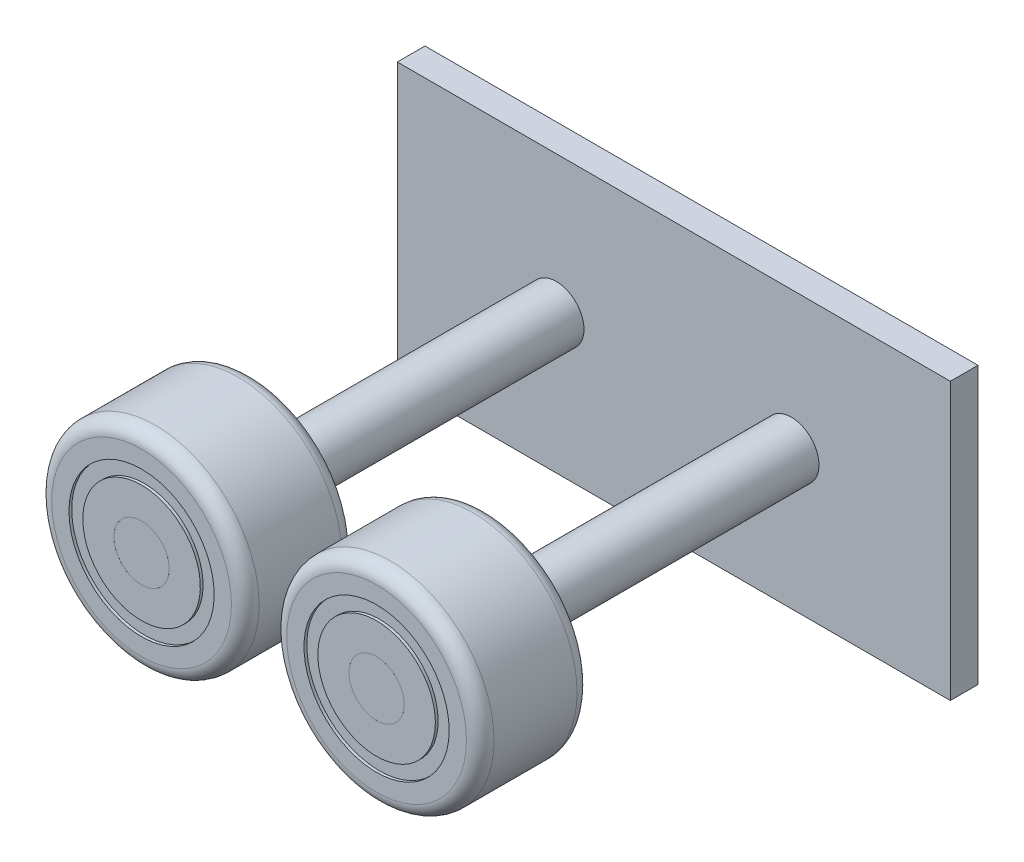
ISO-10303-21;
HEADER;
FILE_DESCRIPTION(('STEP AP214'),'2;1');
FILE_NAME('part.step','',(''),(''),'','','');
FILE_SCHEMA(('AUTOMOTIVE_DESIGN { 1 0 10303 214 1 1 1 1 }'));
ENDSEC;
DATA;
#1=APPLICATION_CONTEXT('core data for automotive mechanical design processes');
#2=APPLICATION_PROTOCOL_DEFINITION('international standard','automotive_design',2000,#1);
#3=PRODUCT_CONTEXT('',#1,'mechanical');
#4=PRODUCT('Part','Part','',(#3));
#5=PRODUCT_RELATED_PRODUCT_CATEGORY('part','',(#4));
#6=PRODUCT_DEFINITION_FORMATION('','',#4);
#7=PRODUCT_DEFINITION_CONTEXT('part definition',#1,'design');
#8=PRODUCT_DEFINITION('design','',#6,#7);
#9=PRODUCT_DEFINITION_SHAPE('','',#8);
#10=(LENGTH_UNIT() NAMED_UNIT(*) SI_UNIT(.MILLI.,.METRE.));
#11=(NAMED_UNIT(*) PLANE_ANGLE_UNIT() SI_UNIT($,.RADIAN.));
#12=(NAMED_UNIT(*) SI_UNIT($,.STERADIAN.) SOLID_ANGLE_UNIT());
#13=UNCERTAINTY_MEASURE_WITH_UNIT(LENGTH_MEASURE(1.E-05),#10,'distance_accuracy_value','');
#14=(GEOMETRIC_REPRESENTATION_CONTEXT(3) GLOBAL_UNCERTAINTY_ASSIGNED_CONTEXT((#13)) GLOBAL_UNIT_ASSIGNED_CONTEXT((#10,
#11,#12)) REPRESENTATION_CONTEXT('',''));
#15=CARTESIAN_POINT('',(0.,0.,0.));
#16=DIRECTION('',(0.,0.,1.));
#17=DIRECTION('',(1.,0.,0.));
#18=AXIS2_PLACEMENT_3D('',#15,#16,#17);
#19=CARTESIAN_POINT('',(9.44372380912966,27.6127548913792,56.535528157347));
#20=DIRECTION('',(0.,0.,-1.));
#21=DIRECTION('',(0.994516748842321,-0.104577417601032,0.));
#22=AXIS2_PLACEMENT_3D('',#19,#20,#21);
#23=CYLINDRICAL_SURFACE('',#22,7.5);
#24=CARTESIAN_POINT('',(9.44372380912966,27.6127548913792,49.535528157347));
#25=DIRECTION('',(0.,0.,1.));
#26=DIRECTION('',(-0.994516748842321,0.104577417601032,0.));
#27=AXIS2_PLACEMENT_3D('',#24,#25,#26);
#28=CIRCLE('',#27,7.5);
#29=CARTESIAN_POINT('',(1.98484819281225,28.3970855233869,49.535528157347));
#30=VERTEX_POINT('',#29);
#31=EDGE_CURVE('P0_E26',#30,#30,#28,.T.);
#32=ORIENTED_EDGE('',*,*,#31,.T.);
#33=EDGE_LOOP('',(#32));
#34=FACE_BOUND('',#33,.T.);
#35=CARTESIAN_POINT('',(9.44372380912966,27.6127548913792,55.535528157347));
#36=DIRECTION('',(0.,0.,1.));
#37=DIRECTION('',(-0.994516748842321,0.104577417601032,0.));
#38=AXIS2_PLACEMENT_3D('',#35,#36,#37);
#39=CIRCLE('',#38,7.5);
#40=CARTESIAN_POINT('',(1.98484819281225,28.3970855233869,55.535528157347));
#41=VERTEX_POINT('',#40);
#42=EDGE_CURVE('P0_E31',#41,#41,#39,.F.);
#43=ORIENTED_EDGE('',*,*,#42,.T.);
#44=EDGE_LOOP('',(#43));
#45=FACE_BOUND('',#44,.T.);
#46=ADVANCED_FACE('P0_F14',(#34,#45),#23,.T.);
#47=CARTESIAN_POINT('',(9.44372380912966,27.6127548913792,56.535528157347));
#48=DIRECTION('',(0.,0.,1.));
#49=DIRECTION('',(-0.994516748842321,0.104577417601032,0.));
#50=AXIS2_PLACEMENT_3D('',#47,#48,#49);
#51=PLANE('',#50);
#52=CARTESIAN_POINT('',(9.44372380912966,27.6127548913792,56.535528157347));
#53=DIRECTION('',(0.,0.,1.));
#54=DIRECTION('',(-0.994516748842321,0.104577417601032,0.));
#55=AXIS2_PLACEMENT_3D('',#52,#53,#54);
#56=CIRCLE('',#55,5.25);
#57=CARTESIAN_POINT('',(4.22251087770747,28.1617863337846,56.535528157347));
#58=VERTEX_POINT('',#57);
#59=EDGE_CURVE('P0_E35',#58,#58,#56,.T.);
#60=ORIENTED_EDGE('',*,*,#59,.F.);
#61=EDGE_LOOP('',(#60));
#62=FACE_BOUND('',#61,.T.);
#63=CARTESIAN_POINT('',(9.44372380912966,27.6127548913792,56.535528157347));
#64=DIRECTION('',(0.,0.,1.));
#65=DIRECTION('',(-0.994516748842321,0.104577417601032,0.));
#66=AXIS2_PLACEMENT_3D('',#63,#64,#65);
#67=CIRCLE('',#66,6.5);
#68=CARTESIAN_POINT('',(2.97936494165457,28.2925081057859,56.535528157347));
#69=VERTEX_POINT('',#68);
#70=EDGE_CURVE('P0_E10',#69,#69,#67,.T.);
#71=ORIENTED_EDGE('',*,*,#70,.T.);
#72=EDGE_LOOP('',(#71));
#73=FACE_BOUND('',#72,.T.);
#74=ADVANCED_FACE('P0_F80',(#62,#73),#51,.T.);
#75=CARTESIAN_POINT('',(9.44372380912966,27.6127548913792,48.535528157347));
#76=DIRECTION('',(0.,0.,1.));
#77=DIRECTION('',(-0.994516748842321,0.104577417601032,0.));
#78=AXIS2_PLACEMENT_3D('',#75,#76,#77);
#79=PLANE('',#78);
#80=CARTESIAN_POINT('',(9.44372380912966,27.6127548913792,48.535528157347));
#81=DIRECTION('',(0.,0.,1.));
#82=DIRECTION('',(-0.994516748842321,0.104577417601032,0.));
#83=AXIS2_PLACEMENT_3D('',#80,#81,#82);
#84=CIRCLE('',#83,5.25);
#85=CARTESIAN_POINT('',(4.22251087770747,28.1617863337846,48.535528157347));
#86=VERTEX_POINT('',#85);
#87=EDGE_CURVE('P0_E47',#86,#86,#84,.T.);
#88=ORIENTED_EDGE('',*,*,#87,.T.);
#89=EDGE_LOOP('',(#88));
#90=FACE_BOUND('',#89,.T.);
#91=CARTESIAN_POINT('',(9.44372380912966,27.6127548913792,48.535528157347));
#92=DIRECTION('',(0.,0.,1.));
#93=DIRECTION('',(-0.994516748842321,0.104577417601032,0.));
#94=AXIS2_PLACEMENT_3D('',#91,#92,#93);
#95=CIRCLE('',#94,6.5);
#96=CARTESIAN_POINT('',(2.97936494165457,28.2925081057859,48.535528157347));
#97=VERTEX_POINT('',#96);
#98=EDGE_CURVE('P0_E22',#97,#97,#95,.F.);
#99=ORIENTED_EDGE('',*,*,#98,.T.);
#100=EDGE_LOOP('',(#99));
#101=FACE_BOUND('',#100,.T.);
#102=ADVANCED_FACE('P0_F77',(#90,#101),#79,.F.);
#103=CARTESIAN_POINT('',(9.44372380912966,27.6127548913792,49.535528157347));
#104=DIRECTION('',(0.,0.,1.));
#105=DIRECTION('',(-0.994516748842321,0.104577417601032,0.));
#106=AXIS2_PLACEMENT_3D('',#103,#104,#105);
#107=TOROIDAL_SURFACE('',#106,6.5,1.);
#108=ORIENTED_EDGE('',*,*,#98,.F.);
#109=EDGE_LOOP('',(#108));
#110=FACE_BOUND('',#109,.T.);
#111=ORIENTED_EDGE('',*,*,#31,.F.);
#112=EDGE_LOOP('',(#111));
#113=FACE_BOUND('',#112,.T.);
#114=ADVANCED_FACE('P0_F90',(#110,#113),#107,.T.);
#115=CARTESIAN_POINT('',(9.44372380912966,27.6127548913792,55.535528157347));
#116=DIRECTION('',(0.,0.,1.));
#117=DIRECTION('',(-0.994516748842321,0.104577417601032,0.));
#118=AXIS2_PLACEMENT_3D('',#115,#116,#117);
#119=TOROIDAL_SURFACE('',#118,6.5,1.);
#120=ORIENTED_EDGE('',*,*,#42,.F.);
#121=EDGE_LOOP('',(#120));
#122=FACE_BOUND('',#121,.T.);
#123=ORIENTED_EDGE('',*,*,#70,.F.);
#124=EDGE_LOOP('',(#123));
#125=FACE_BOUND('',#124,.T.);
#126=ADVANCED_FACE('P0_F16',(#122,#125),#119,.T.);
#127=CARTESIAN_POINT('',(9.44372380912966,27.6127548913792,56.335528157347));
#128=DIRECTION('',(0.,0.,1.));
#129=DIRECTION('',(-0.994516748842321,0.104577417601032,0.));
#130=AXIS2_PLACEMENT_3D('',#127,#128,#129);
#131=CYLINDRICAL_SURFACE('',#130,5.25);
#132=CARTESIAN_POINT('',(9.44372380912966,27.6127548913792,56.335528157347));
#133=DIRECTION('',(0.,0.,1.));
#134=DIRECTION('',(-0.994516748842321,0.104577417601032,0.));
#135=AXIS2_PLACEMENT_3D('',#132,#133,#134);
#136=CIRCLE('',#135,5.25);
#137=CARTESIAN_POINT('',(4.22251087770747,28.1617863337846,56.335528157347));
#138=VERTEX_POINT('',#137);
#139=EDGE_CURVE('P0_E34',#138,#138,#136,.T.);
#140=ORIENTED_EDGE('',*,*,#139,.F.);
#141=EDGE_LOOP('',(#140));
#142=FACE_BOUND('',#141,.T.);
#143=ORIENTED_EDGE('',*,*,#59,.T.);
#144=EDGE_LOOP('',(#143));
#145=FACE_BOUND('',#144,.T.);
#146=ADVANCED_FACE('P0_F97',(#142,#145),#131,.F.);
#147=CARTESIAN_POINT('',(9.44372380912966,27.6127548913792,56.335528157347));
#148=DIRECTION('',(0.,0.,1.));
#149=DIRECTION('',(-0.994516748842321,0.104577417601032,0.));
#150=AXIS2_PLACEMENT_3D('',#147,#148,#149);
#151=PLANE('',#150);
#152=CARTESIAN_POINT('',(9.44372380912966,27.6127548913792,56.335528157347));
#153=DIRECTION('',(0.,0.,1.));
#154=DIRECTION('',(-0.994516748842321,0.104577417601032,0.));
#155=AXIS2_PLACEMENT_3D('',#152,#153,#154);
#156=CIRCLE('',#155,4.25);
#157=CARTESIAN_POINT('',(5.21702762654979,28.0572089161836,56.335528157347));
#158=VERTEX_POINT('',#157);
#159=EDGE_CURVE('P0_E38',#158,#158,#156,.T.);
#160=ORIENTED_EDGE('',*,*,#159,.F.);
#161=EDGE_LOOP('',(#160));
#162=FACE_BOUND('',#161,.T.);
#163=ORIENTED_EDGE('',*,*,#139,.T.);
#164=EDGE_LOOP('',(#163));
#165=FACE_BOUND('',#164,.T.);
#166=ADVANCED_FACE('P0_F124',(#162,#165),#151,.T.);
#167=CARTESIAN_POINT('',(9.44372380912966,27.6127548913792,56.335528157347));
#168=DIRECTION('',(0.,0.,1.));
#169=DIRECTION('',(-0.994516748842321,0.104577417601032,0.));
#170=AXIS2_PLACEMENT_3D('',#167,#168,#169);
#171=CYLINDRICAL_SURFACE('',#170,4.25);
#172=ORIENTED_EDGE('',*,*,#159,.T.);
#173=EDGE_LOOP('',(#172));
#174=FACE_BOUND('',#173,.T.);
#175=CARTESIAN_POINT('',(9.44372380912966,27.6127548913792,56.535528157347));
#176=DIRECTION('',(0.,0.,1.));
#177=DIRECTION('',(-0.994516748842321,0.104577417601032,0.));
#178=AXIS2_PLACEMENT_3D('',#175,#176,#177);
#179=CIRCLE('',#178,4.25);
#180=CARTESIAN_POINT('',(5.21702762654979,28.0572089161836,56.535528157347));
#181=VERTEX_POINT('',#180);
#182=EDGE_CURVE('P0_E41',#181,#181,#179,.T.);
#183=ORIENTED_EDGE('',*,*,#182,.F.);
#184=EDGE_LOOP('',(#183));
#185=FACE_BOUND('',#184,.T.);
#186=ADVANCED_FACE('P0_F121',(#174,#185),#171,.T.);
#187=CARTESIAN_POINT('',(9.44372380912966,27.6127548913792,56.535528157347));
#188=DIRECTION('',(0.,0.,1.));
#189=DIRECTION('',(-0.994516748842321,0.104577417601032,0.));
#190=AXIS2_PLACEMENT_3D('',#187,#188,#189);
#191=CIRCLE('',#190,2.);
#192=CARTESIAN_POINT('',(7.45469031144502,27.8219097265813,56.535528157347));
#193=VERTEX_POINT('',#192);
#194=EDGE_CURVE('P0_E58',#193,#193,#191,.T.);
#195=ORIENTED_EDGE('',*,*,#194,.F.);
#196=EDGE_LOOP('',(#195));
#197=FACE_BOUND('',#196,.T.);
#198=ORIENTED_EDGE('',*,*,#182,.T.);
#199=EDGE_LOOP('',(#198));
#200=FACE_BOUND('',#199,.T.);
#201=ADVANCED_FACE('P0_F88',(#197,#200),#51,.T.);
#202=CARTESIAN_POINT('',(9.44372380912966,27.6127548913792,48.735528157347));
#203=DIRECTION('',(0.,0.,-1.));
#204=DIRECTION('',(-0.994516748842321,0.104577417601032,0.));
#205=AXIS2_PLACEMENT_3D('',#202,#203,#204);
#206=PLANE('',#205);
#207=CARTESIAN_POINT('',(9.44372380912966,27.6127548913792,48.735528157347));
#208=DIRECTION('',(0.,0.,1.));
#209=DIRECTION('',(-0.994516748842321,0.104577417601032,0.));
#210=AXIS2_PLACEMENT_3D('',#207,#208,#209);
#211=CIRCLE('',#210,5.25);
#212=CARTESIAN_POINT('',(4.22251087770747,28.1617863337846,48.735528157347));
#213=VERTEX_POINT('',#212);
#214=EDGE_CURVE('P0_E44',#213,#213,#211,.T.);
#215=ORIENTED_EDGE('',*,*,#214,.F.);
#216=EDGE_LOOP('',(#215));
#217=FACE_BOUND('',#216,.T.);
#218=CARTESIAN_POINT('',(9.44372380912966,27.6127548913792,48.735528157347));
#219=DIRECTION('',(0.,0.,1.));
#220=DIRECTION('',(-0.994516748842321,0.104577417601032,0.));
#221=AXIS2_PLACEMENT_3D('',#218,#219,#220);
#222=CIRCLE('',#221,4.25);
#223=CARTESIAN_POINT('',(5.21702762654979,28.0572089161836,48.735528157347));
#224=VERTEX_POINT('',#223);
#225=EDGE_CURVE('P0_E50',#224,#224,#222,.T.);
#226=ORIENTED_EDGE('',*,*,#225,.T.);
#227=EDGE_LOOP('',(#226));
#228=FACE_BOUND('',#227,.T.);
#229=ADVANCED_FACE('P0_F110',(#217,#228),#206,.T.);
#230=CARTESIAN_POINT('',(9.44372380912966,27.6127548913792,48.735528157347));
#231=DIRECTION('',(0.,0.,-1.));
#232=DIRECTION('',(0.994516748842321,-0.104577417601032,0.));
#233=AXIS2_PLACEMENT_3D('',#230,#231,#232);
#234=CYLINDRICAL_SURFACE('',#233,5.25);
#235=ORIENTED_EDGE('',*,*,#214,.T.);
#236=EDGE_LOOP('',(#235));
#237=FACE_BOUND('',#236,.T.);
#238=ORIENTED_EDGE('',*,*,#87,.F.);
#239=EDGE_LOOP('',(#238));
#240=FACE_BOUND('',#239,.T.);
#241=ADVANCED_FACE('P0_F108',(#237,#240),#234,.F.);
#242=CARTESIAN_POINT('',(9.44372380912966,27.6127548913792,48.735528157347));
#243=DIRECTION('',(0.,0.,-1.));
#244=DIRECTION('',(0.994516748842321,-0.104577417601032,0.));
#245=AXIS2_PLACEMENT_3D('',#242,#243,#244);
#246=CYLINDRICAL_SURFACE('',#245,4.25);
#247=ORIENTED_EDGE('',*,*,#225,.F.);
#248=EDGE_LOOP('',(#247));
#249=FACE_BOUND('',#248,.T.);
#250=CARTESIAN_POINT('',(9.44372380912966,27.6127548913792,48.535528157347));
#251=DIRECTION('',(0.,0.,1.));
#252=DIRECTION('',(-0.994516748842321,0.104577417601032,0.));
#253=AXIS2_PLACEMENT_3D('',#250,#251,#252);
#254=CIRCLE('',#253,4.25);
#255=CARTESIAN_POINT('',(5.21702762654979,28.0572089161836,48.535528157347));
#256=VERTEX_POINT('',#255);
#257=EDGE_CURVE('P0_E53',#256,#256,#254,.T.);
#258=ORIENTED_EDGE('',*,*,#257,.T.);
#259=EDGE_LOOP('',(#258));
#260=FACE_BOUND('',#259,.T.);
#261=ADVANCED_FACE('P0_F75',(#249,#260),#246,.T.);
#262=CARTESIAN_POINT('',(9.44372380912966,27.6127548913792,48.535528157347));
#263=DIRECTION('',(0.,0.,1.));
#264=DIRECTION('',(-0.994516748842321,0.104577417601032,0.));
#265=AXIS2_PLACEMENT_3D('',#262,#263,#264);
#266=CIRCLE('',#265,2.);
#267=CARTESIAN_POINT('',(7.45469031144502,27.8219097265813,48.535528157347));
#268=VERTEX_POINT('',#267);
#269=EDGE_CURVE('P0_E18',#268,#268,#266,.T.);
#270=ORIENTED_EDGE('',*,*,#269,.T.);
#271=EDGE_LOOP('',(#270));
#272=FACE_BOUND('',#271,.T.);
#273=ORIENTED_EDGE('',*,*,#257,.F.);
#274=EDGE_LOOP('',(#273));
#275=FACE_BOUND('',#274,.T.);
#276=ADVANCED_FACE('P0_F65',(#272,#275),#79,.F.);
#277=CARTESIAN_POINT('',(9.44372380912966,27.6127548913792,41.335528157347));
#278=DIRECTION('',(0.,0.,1.));
#279=DIRECTION('',(-0.994516748842321,0.104577417601032,0.));
#280=AXIS2_PLACEMENT_3D('',#277,#278,#279);
#281=CYLINDRICAL_SURFACE('',#280,2.);
#282=ORIENTED_EDGE('',*,*,#194,.T.);
#283=EDGE_LOOP('',(#282));
#284=FACE_BOUND('',#283,.T.);
#285=ORIENTED_EDGE('',*,*,#269,.F.);
#286=EDGE_LOOP('',(#285));
#287=FACE_BOUND('',#286,.T.);
#288=ADVANCED_FACE('P0_F68',(#284,#287),#281,.F.);
#289=CLOSED_SHELL('',(#46,#74,#102,#114,#126,#146,#166,#186,#201,#229,#241,#261,#276,#288));
#290=MANIFOLD_SOLID_BREP('P0_B1',#289);
#291=CARTESIAN_POINT('',(26.4437238091297,27.6127548913792,56.535528157347));
#292=DIRECTION('',(0.,0.,-1.));
#293=DIRECTION('',(-1.,0.,0.));
#294=AXIS2_PLACEMENT_3D('',#291,#292,#293);
#295=CYLINDRICAL_SURFACE('',#294,7.5);
#296=CARTESIAN_POINT('',(26.4437238091297,27.6127548913792,49.535528157347));
#297=DIRECTION('',(0.,0.,1.));
#298=DIRECTION('',(1.,0.,0.));
#299=AXIS2_PLACEMENT_3D('',#296,#297,#298);
#300=CIRCLE('',#299,7.5);
#301=CARTESIAN_POINT('',(33.9437238091297,27.6127548913792,49.535528157347));
#302=VERTEX_POINT('',#301);
#303=EDGE_CURVE('P1_E26',#302,#302,#300,.T.);
#304=ORIENTED_EDGE('',*,*,#303,.T.);
#305=EDGE_LOOP('',(#304));
#306=FACE_BOUND('',#305,.T.);
#307=CARTESIAN_POINT('',(26.4437238091297,27.6127548913792,55.535528157347));
#308=DIRECTION('',(0.,0.,1.));
#309=DIRECTION('',(1.,0.,0.));
#310=AXIS2_PLACEMENT_3D('',#307,#308,#309);
#311=CIRCLE('',#310,7.5);
#312=CARTESIAN_POINT('',(33.9437238091297,27.6127548913792,55.535528157347));
#313=VERTEX_POINT('',#312);
#314=EDGE_CURVE('P1_E31',#313,#313,#311,.F.);
#315=ORIENTED_EDGE('',*,*,#314,.T.);
#316=EDGE_LOOP('',(#315));
#317=FACE_BOUND('',#316,.T.);
#318=ADVANCED_FACE('P1_F14',(#306,#317),#295,.T.);
#319=CARTESIAN_POINT('',(26.4437238091297,27.6127548913792,56.535528157347));
#320=DIRECTION('',(0.,0.,1.));
#321=DIRECTION('',(1.,0.,0.));
#322=AXIS2_PLACEMENT_3D('',#319,#320,#321);
#323=PLANE('',#322);
#324=CARTESIAN_POINT('',(26.4437238091297,27.6127548913792,56.535528157347));
#325=DIRECTION('',(0.,0.,1.));
#326=DIRECTION('',(1.,0.,0.));
#327=AXIS2_PLACEMENT_3D('',#324,#325,#326);
#328=CIRCLE('',#327,5.25);
#329=CARTESIAN_POINT('',(31.6937238091297,27.6127548913792,56.535528157347));
#330=VERTEX_POINT('',#329);
#331=EDGE_CURVE('P1_E35',#330,#330,#328,.T.);
#332=ORIENTED_EDGE('',*,*,#331,.F.);
#333=EDGE_LOOP('',(#332));
#334=FACE_BOUND('',#333,.T.);
#335=CARTESIAN_POINT('',(26.4437238091297,27.6127548913792,56.535528157347));
#336=DIRECTION('',(0.,0.,1.));
#337=DIRECTION('',(1.,0.,0.));
#338=AXIS2_PLACEMENT_3D('',#335,#336,#337);
#339=CIRCLE('',#338,6.5);
#340=CARTESIAN_POINT('',(32.9437238091297,27.6127548913792,56.535528157347));
#341=VERTEX_POINT('',#340);
#342=EDGE_CURVE('P1_E10',#341,#341,#339,.T.);
#343=ORIENTED_EDGE('',*,*,#342,.T.);
#344=EDGE_LOOP('',(#343));
#345=FACE_BOUND('',#344,.T.);
#346=ADVANCED_FACE('P1_F80',(#334,#345),#323,.T.);
#347=CARTESIAN_POINT('',(26.4437238091297,27.6127548913792,48.535528157347));
#348=DIRECTION('',(0.,0.,1.));
#349=DIRECTION('',(1.,0.,0.));
#350=AXIS2_PLACEMENT_3D('',#347,#348,#349);
#351=PLANE('',#350);
#352=CARTESIAN_POINT('',(26.4437238091297,27.6127548913792,48.535528157347));
#353=DIRECTION('',(0.,0.,1.));
#354=DIRECTION('',(1.,0.,0.));
#355=AXIS2_PLACEMENT_3D('',#352,#353,#354);
#356=CIRCLE('',#355,5.25);
#357=CARTESIAN_POINT('',(31.6937238091297,27.6127548913792,48.535528157347));
#358=VERTEX_POINT('',#357);
#359=EDGE_CURVE('P1_E47',#358,#358,#356,.T.);
#360=ORIENTED_EDGE('',*,*,#359,.T.);
#361=EDGE_LOOP('',(#360));
#362=FACE_BOUND('',#361,.T.);
#363=CARTESIAN_POINT('',(26.4437238091297,27.6127548913792,48.535528157347));
#364=DIRECTION('',(0.,0.,1.));
#365=DIRECTION('',(1.,0.,0.));
#366=AXIS2_PLACEMENT_3D('',#363,#364,#365);
#367=CIRCLE('',#366,6.5);
#368=CARTESIAN_POINT('',(32.9437238091297,27.6127548913792,48.535528157347));
#369=VERTEX_POINT('',#368);
#370=EDGE_CURVE('P1_E22',#369,#369,#367,.F.);
#371=ORIENTED_EDGE('',*,*,#370,.T.);
#372=EDGE_LOOP('',(#371));
#373=FACE_BOUND('',#372,.T.);
#374=ADVANCED_FACE('P1_F77',(#362,#373),#351,.F.);
#375=CARTESIAN_POINT('',(26.4437238091297,27.6127548913792,49.535528157347));
#376=DIRECTION('',(0.,0.,1.));
#377=DIRECTION('',(1.,0.,0.));
#378=AXIS2_PLACEMENT_3D('',#375,#376,#377);
#379=TOROIDAL_SURFACE('',#378,6.5,1.);
#380=ORIENTED_EDGE('',*,*,#370,.F.);
#381=EDGE_LOOP('',(#380));
#382=FACE_BOUND('',#381,.T.);
#383=ORIENTED_EDGE('',*,*,#303,.F.);
#384=EDGE_LOOP('',(#383));
#385=FACE_BOUND('',#384,.T.);
#386=ADVANCED_FACE('P1_F90',(#382,#385),#379,.T.);
#387=CARTESIAN_POINT('',(26.4437238091297,27.6127548913792,55.535528157347));
#388=DIRECTION('',(0.,0.,1.));
#389=DIRECTION('',(1.,0.,0.));
#390=AXIS2_PLACEMENT_3D('',#387,#388,#389);
#391=TOROIDAL_SURFACE('',#390,6.5,1.);
#392=ORIENTED_EDGE('',*,*,#314,.F.);
#393=EDGE_LOOP('',(#392));
#394=FACE_BOUND('',#393,.T.);
#395=ORIENTED_EDGE('',*,*,#342,.F.);
#396=EDGE_LOOP('',(#395));
#397=FACE_BOUND('',#396,.T.);
#398=ADVANCED_FACE('P1_F16',(#394,#397),#391,.T.);
#399=CARTESIAN_POINT('',(26.4437238091297,27.6127548913792,56.335528157347));
#400=DIRECTION('',(0.,0.,1.));
#401=DIRECTION('',(1.,0.,0.));
#402=AXIS2_PLACEMENT_3D('',#399,#400,#401);
#403=CYLINDRICAL_SURFACE('',#402,5.25);
#404=CARTESIAN_POINT('',(26.4437238091297,27.6127548913792,56.335528157347));
#405=DIRECTION('',(0.,0.,1.));
#406=DIRECTION('',(1.,0.,0.));
#407=AXIS2_PLACEMENT_3D('',#404,#405,#406);
#408=CIRCLE('',#407,5.25);
#409=CARTESIAN_POINT('',(31.6937238091297,27.6127548913792,56.335528157347));
#410=VERTEX_POINT('',#409);
#411=EDGE_CURVE('P1_E34',#410,#410,#408,.T.);
#412=ORIENTED_EDGE('',*,*,#411,.F.);
#413=EDGE_LOOP('',(#412));
#414=FACE_BOUND('',#413,.T.);
#415=ORIENTED_EDGE('',*,*,#331,.T.);
#416=EDGE_LOOP('',(#415));
#417=FACE_BOUND('',#416,.T.);
#418=ADVANCED_FACE('P1_F97',(#414,#417),#403,.F.);
#419=CARTESIAN_POINT('',(26.4437238091297,27.6127548913792,56.335528157347));
#420=DIRECTION('',(0.,0.,1.));
#421=DIRECTION('',(1.,0.,0.));
#422=AXIS2_PLACEMENT_3D('',#419,#420,#421);
#423=PLANE('',#422);
#424=CARTESIAN_POINT('',(26.4437238091297,27.6127548913792,56.335528157347));
#425=DIRECTION('',(0.,0.,1.));
#426=DIRECTION('',(1.,0.,0.));
#427=AXIS2_PLACEMENT_3D('',#424,#425,#426);
#428=CIRCLE('',#427,4.25);
#429=CARTESIAN_POINT('',(30.6937238091297,27.6127548913792,56.335528157347));
#430=VERTEX_POINT('',#429);
#431=EDGE_CURVE('P1_E38',#430,#430,#428,.T.);
#432=ORIENTED_EDGE('',*,*,#431,.F.);
#433=EDGE_LOOP('',(#432));
#434=FACE_BOUND('',#433,.T.);
#435=ORIENTED_EDGE('',*,*,#411,.T.);
#436=EDGE_LOOP('',(#435));
#437=FACE_BOUND('',#436,.T.);
#438=ADVANCED_FACE('P1_F124',(#434,#437),#423,.T.);
#439=CARTESIAN_POINT('',(26.4437238091297,27.6127548913792,56.335528157347));
#440=DIRECTION('',(0.,0.,1.));
#441=DIRECTION('',(1.,0.,0.));
#442=AXIS2_PLACEMENT_3D('',#439,#440,#441);
#443=CYLINDRICAL_SURFACE('',#442,4.25);
#444=ORIENTED_EDGE('',*,*,#431,.T.);
#445=EDGE_LOOP('',(#444));
#446=FACE_BOUND('',#445,.T.);
#447=CARTESIAN_POINT('',(26.4437238091297,27.6127548913792,56.535528157347));
#448=DIRECTION('',(0.,0.,1.));
#449=DIRECTION('',(1.,0.,0.));
#450=AXIS2_PLACEMENT_3D('',#447,#448,#449);
#451=CIRCLE('',#450,4.25);
#452=CARTESIAN_POINT('',(30.6937238091297,27.6127548913792,56.535528157347));
#453=VERTEX_POINT('',#452);
#454=EDGE_CURVE('P1_E41',#453,#453,#451,.T.);
#455=ORIENTED_EDGE('',*,*,#454,.F.);
#456=EDGE_LOOP('',(#455));
#457=FACE_BOUND('',#456,.T.);
#458=ADVANCED_FACE('P1_F121',(#446,#457),#443,.T.);
#459=CARTESIAN_POINT('',(26.4437238091297,27.6127548913792,56.535528157347));
#460=DIRECTION('',(0.,0.,1.));
#461=DIRECTION('',(1.,0.,0.));
#462=AXIS2_PLACEMENT_3D('',#459,#460,#461);
#463=CIRCLE('',#462,2.);
#464=CARTESIAN_POINT('',(28.4437238091297,27.6127548913792,56.535528157347));
#465=VERTEX_POINT('',#464);
#466=EDGE_CURVE('P1_E58',#465,#465,#463,.T.);
#467=ORIENTED_EDGE('',*,*,#466,.F.);
#468=EDGE_LOOP('',(#467));
#469=FACE_BOUND('',#468,.T.);
#470=ORIENTED_EDGE('',*,*,#454,.T.);
#471=EDGE_LOOP('',(#470));
#472=FACE_BOUND('',#471,.T.);
#473=ADVANCED_FACE('P1_F88',(#469,#472),#323,.T.);
#474=CARTESIAN_POINT('',(26.4437238091297,27.6127548913792,48.735528157347));
#475=DIRECTION('',(0.,0.,-1.));
#476=DIRECTION('',(1.,0.,0.));
#477=AXIS2_PLACEMENT_3D('',#474,#475,#476);
#478=PLANE('',#477);
#479=CARTESIAN_POINT('',(26.4437238091297,27.6127548913792,48.735528157347));
#480=DIRECTION('',(0.,0.,1.));
#481=DIRECTION('',(1.,0.,0.));
#482=AXIS2_PLACEMENT_3D('',#479,#480,#481);
#483=CIRCLE('',#482,5.25);
#484=CARTESIAN_POINT('',(31.6937238091297,27.6127548913792,48.735528157347));
#485=VERTEX_POINT('',#484);
#486=EDGE_CURVE('P1_E44',#485,#485,#483,.T.);
#487=ORIENTED_EDGE('',*,*,#486,.F.);
#488=EDGE_LOOP('',(#487));
#489=FACE_BOUND('',#488,.T.);
#490=CARTESIAN_POINT('',(26.4437238091297,27.6127548913792,48.735528157347));
#491=DIRECTION('',(0.,0.,1.));
#492=DIRECTION('',(1.,0.,0.));
#493=AXIS2_PLACEMENT_3D('',#490,#491,#492);
#494=CIRCLE('',#493,4.25);
#495=CARTESIAN_POINT('',(30.6937238091297,27.6127548913792,48.735528157347));
#496=VERTEX_POINT('',#495);
#497=EDGE_CURVE('P1_E50',#496,#496,#494,.T.);
#498=ORIENTED_EDGE('',*,*,#497,.T.);
#499=EDGE_LOOP('',(#498));
#500=FACE_BOUND('',#499,.T.);
#501=ADVANCED_FACE('P1_F110',(#489,#500),#478,.T.);
#502=CARTESIAN_POINT('',(26.4437238091297,27.6127548913792,48.735528157347));
#503=DIRECTION('',(0.,0.,-1.));
#504=DIRECTION('',(-1.,0.,0.));
#505=AXIS2_PLACEMENT_3D('',#502,#503,#504);
#506=CYLINDRICAL_SURFACE('',#505,5.25);
#507=ORIENTED_EDGE('',*,*,#486,.T.);
#508=EDGE_LOOP('',(#507));
#509=FACE_BOUND('',#508,.T.);
#510=ORIENTED_EDGE('',*,*,#359,.F.);
#511=EDGE_LOOP('',(#510));
#512=FACE_BOUND('',#511,.T.);
#513=ADVANCED_FACE('P1_F108',(#509,#512),#506,.F.);
#514=CARTESIAN_POINT('',(26.4437238091297,27.6127548913792,48.735528157347));
#515=DIRECTION('',(0.,0.,-1.));
#516=DIRECTION('',(-1.,0.,0.));
#517=AXIS2_PLACEMENT_3D('',#514,#515,#516);
#518=CYLINDRICAL_SURFACE('',#517,4.25);
#519=ORIENTED_EDGE('',*,*,#497,.F.);
#520=EDGE_LOOP('',(#519));
#521=FACE_BOUND('',#520,.T.);
#522=CARTESIAN_POINT('',(26.4437238091297,27.6127548913792,48.535528157347));
#523=DIRECTION('',(0.,0.,1.));
#524=DIRECTION('',(1.,0.,0.));
#525=AXIS2_PLACEMENT_3D('',#522,#523,#524);
#526=CIRCLE('',#525,4.25);
#527=CARTESIAN_POINT('',(30.6937238091297,27.6127548913792,48.535528157347));
#528=VERTEX_POINT('',#527);
#529=EDGE_CURVE('P1_E53',#528,#528,#526,.T.);
#530=ORIENTED_EDGE('',*,*,#529,.T.);
#531=EDGE_LOOP('',(#530));
#532=FACE_BOUND('',#531,.T.);
#533=ADVANCED_FACE('P1_F75',(#521,#532),#518,.T.);
#534=CARTESIAN_POINT('',(26.4437238091297,27.6127548913792,48.535528157347));
#535=DIRECTION('',(0.,0.,1.));
#536=DIRECTION('',(1.,0.,0.));
#537=AXIS2_PLACEMENT_3D('',#534,#535,#536);
#538=CIRCLE('',#537,2.);
#539=CARTESIAN_POINT('',(28.4437238091297,27.6127548913792,48.535528157347));
#540=VERTEX_POINT('',#539);
#541=EDGE_CURVE('P1_E18',#540,#540,#538,.T.);
#542=ORIENTED_EDGE('',*,*,#541,.T.);
#543=EDGE_LOOP('',(#542));
#544=FACE_BOUND('',#543,.T.);
#545=ORIENTED_EDGE('',*,*,#529,.F.);
#546=EDGE_LOOP('',(#545));
#547=FACE_BOUND('',#546,.T.);
#548=ADVANCED_FACE('P1_F65',(#544,#547),#351,.F.);
#549=CARTESIAN_POINT('',(26.4437238091297,27.6127548913792,41.335528157347));
#550=DIRECTION('',(0.,0.,1.));
#551=DIRECTION('',(1.,0.,0.));
#552=AXIS2_PLACEMENT_3D('',#549,#550,#551);
#553=CYLINDRICAL_SURFACE('',#552,2.);
#554=ORIENTED_EDGE('',*,*,#466,.T.);
#555=EDGE_LOOP('',(#554));
#556=FACE_BOUND('',#555,.T.);
#557=ORIENTED_EDGE('',*,*,#541,.F.);
#558=EDGE_LOOP('',(#557));
#559=FACE_BOUND('',#558,.T.);
#560=ADVANCED_FACE('P1_F68',(#556,#559),#553,.F.);
#561=CLOSED_SHELL('',(#318,#346,#374,#386,#398,#418,#438,#458,#473,#501,#513,#533,#548,#560));
#562=MANIFOLD_SOLID_BREP('P1_B1',#561);
#563=CARTESIAN_POINT('',(37.9437238091297,37.6127548913792,26.535528157347));
#564=DIRECTION('',(-1.,0.,0.));
#565=DIRECTION('',(0.,0.,1.));
#566=AXIS2_PLACEMENT_3D('',#563,#564,#565);
#567=PLANE('',#566);
#568=DIRECTION('',(0.,1.,0.));
#569=VECTOR('',#568,1.);
#570=CARTESIAN_POINT('',(37.9437238091297,37.6127548913792,24.535528157347));
#571=LINE('',#570,#569);
#572=CARTESIAN_POINT('',(37.9437238091297,17.6127548913792,24.535528157347));
#573=VERTEX_POINT('',#572);
#574=CARTESIAN_POINT('',(37.9437238091297,37.6127548913792,24.535528157347));
#575=VERTEX_POINT('',#574);
#576=EDGE_CURVE('P2_E79',#573,#575,#571,.T.);
#577=ORIENTED_EDGE('',*,*,#576,.T.);
#578=DIRECTION('',(0.,0.,-1.));
#579=VECTOR('',#578,1.);
#580=CARTESIAN_POINT('',(37.9437238091297,37.6127548913792,26.535528157347));
#581=LINE('',#580,#579);
#582=CARTESIAN_POINT('',(37.9437238091297,37.6127548913792,26.535528157347));
#583=VERTEX_POINT('',#582);
#584=EDGE_CURVE('P2_E11',#583,#575,#581,.T.);
#585=ORIENTED_EDGE('',*,*,#584,.F.);
#586=DIRECTION('',(0.,1.,0.));
#587=VECTOR('',#586,1.);
#588=CARTESIAN_POINT('',(37.9437238091297,37.6127548913792,26.535528157347));
#589=LINE('',#588,#587);
#590=CARTESIAN_POINT('',(37.9437238091297,17.6127548913792,26.535528157347));
#591=VERTEX_POINT('',#590);
#592=EDGE_CURVE('P2_E67',#591,#583,#589,.T.);
#593=ORIENTED_EDGE('',*,*,#592,.F.);
#594=DIRECTION('',(0.,0.,-1.));
#595=VECTOR('',#594,1.);
#596=CARTESIAN_POINT('',(37.9437238091297,17.6127548913792,26.535528157347));
#597=LINE('',#596,#595);
#598=EDGE_CURVE('P2_E75',#591,#573,#597,.T.);
#599=ORIENTED_EDGE('',*,*,#598,.T.);
#600=EDGE_LOOP('',(#577,#585,#593,#599));
#601=FACE_BOUND('',#600,.T.);
#602=ADVANCED_FACE('P2_F16',(#601),#567,.F.);
#603=CARTESIAN_POINT('',(-2.05627619087035,37.6127548913792,26.535528157347));
#604=DIRECTION('',(0.,-1.,0.));
#605=DIRECTION('',(0.,0.,-1.));
#606=AXIS2_PLACEMENT_3D('',#603,#604,#605);
#607=PLANE('',#606);
#608=DIRECTION('',(-1.,0.,0.));
#609=VECTOR('',#608,1.);
#610=CARTESIAN_POINT('',(-2.05627619087035,37.6127548913792,24.535528157347));
#611=LINE('',#610,#609);
#612=CARTESIAN_POINT('',(-2.05627619087035,37.6127548913792,24.535528157347));
#613=VERTEX_POINT('',#612);
#614=EDGE_CURVE('P2_E71',#575,#613,#611,.T.);
#615=ORIENTED_EDGE('',*,*,#614,.T.);
#616=DIRECTION('',(0.,0.,-1.));
#617=VECTOR('',#616,1.);
#618=CARTESIAN_POINT('',(-2.05627619087035,37.6127548913792,26.535528157347));
#619=LINE('',#618,#617);
#620=CARTESIAN_POINT('',(-2.05627619087035,37.6127548913792,26.535528157347));
#621=VERTEX_POINT('',#620);
#622=EDGE_CURVE('P2_E24',#621,#613,#619,.T.);
#623=ORIENTED_EDGE('',*,*,#622,.F.);
#624=DIRECTION('',(-1.,0.,0.));
#625=VECTOR('',#624,1.);
#626=CARTESIAN_POINT('',(-2.05627619087035,37.6127548913792,26.535528157347));
#627=LINE('',#626,#625);
#628=EDGE_CURVE('P2_E62',#583,#621,#627,.T.);
#629=ORIENTED_EDGE('',*,*,#628,.F.);
#630=ORIENTED_EDGE('',*,*,#584,.T.);
#631=EDGE_LOOP('',(#615,#623,#629,#630));
#632=FACE_BOUND('',#631,.T.);
#633=ADVANCED_FACE('P2_F70',(#632),#607,.F.);
#634=CARTESIAN_POINT('',(-2.05627619087035,37.6127548913792,26.535528157347));
#635=DIRECTION('',(1.,0.,0.));
#636=DIRECTION('',(0.,0.,-1.));
#637=AXIS2_PLACEMENT_3D('',#634,#635,#636);
#638=PLANE('',#637);
#639=DIRECTION('',(0.,-1.,0.));
#640=VECTOR('',#639,1.);
#641=CARTESIAN_POINT('',(-2.05627619087035,37.6127548913792,24.535528157347));
#642=LINE('',#641,#640);
#643=CARTESIAN_POINT('',(-2.05627619087035,17.6127548913792,24.535528157347));
#644=VERTEX_POINT('',#643);
#645=EDGE_CURVE('P2_E49',#613,#644,#642,.T.);
#646=ORIENTED_EDGE('',*,*,#645,.T.);
#647=DIRECTION('',(0.,0.,-1.));
#648=VECTOR('',#647,1.);
#649=CARTESIAN_POINT('',(-2.05627619087035,17.6127548913792,26.535528157347));
#650=LINE('',#649,#648);
#651=CARTESIAN_POINT('',(-2.05627619087035,17.6127548913792,26.535528157347));
#652=VERTEX_POINT('',#651);
#653=EDGE_CURVE('P2_E72',#652,#644,#650,.T.);
#654=ORIENTED_EDGE('',*,*,#653,.F.);
#655=DIRECTION('',(0.,-1.,0.));
#656=VECTOR('',#655,1.);
#657=CARTESIAN_POINT('',(-2.05627619087035,37.6127548913792,26.535528157347));
#658=LINE('',#657,#656);
#659=EDGE_CURVE('P2_E65',#621,#652,#658,.T.);
#660=ORIENTED_EDGE('',*,*,#659,.F.);
#661=ORIENTED_EDGE('',*,*,#622,.T.);
#662=EDGE_LOOP('',(#646,#654,#660,#661));
#663=FACE_BOUND('',#662,.T.);
#664=ADVANCED_FACE('P2_F73',(#663),#638,.F.);
#665=CARTESIAN_POINT('',(-2.05627619087035,17.6127548913792,26.535528157347));
#666=DIRECTION('',(0.,1.,0.));
#667=DIRECTION('',(0.,0.,1.));
#668=AXIS2_PLACEMENT_3D('',#665,#666,#667);
#669=PLANE('',#668);
#670=DIRECTION('',(1.,0.,0.));
#671=VECTOR('',#670,1.);
#672=CARTESIAN_POINT('',(-2.05627619087035,17.6127548913792,24.535528157347));
#673=LINE('',#672,#671);
#674=EDGE_CURVE('P2_E55',#644,#573,#673,.T.);
#675=ORIENTED_EDGE('',*,*,#674,.T.);
#676=ORIENTED_EDGE('',*,*,#598,.F.);
#677=DIRECTION('',(1.,0.,0.));
#678=VECTOR('',#677,1.);
#679=CARTESIAN_POINT('',(-2.05627619087035,17.6127548913792,26.535528157347));
#680=LINE('',#679,#678);
#681=EDGE_CURVE('P2_E32',#652,#591,#680,.T.);
#682=ORIENTED_EDGE('',*,*,#681,.F.);
#683=ORIENTED_EDGE('',*,*,#653,.T.);
#684=EDGE_LOOP('',(#675,#676,#682,#683));
#685=FACE_BOUND('',#684,.T.);
#686=ADVANCED_FACE('P2_F87',(#685),#669,.F.);
#687=CARTESIAN_POINT('',(17.9437238091297,27.6127548913792,26.535528157347));
#688=DIRECTION('',(0.,0.,1.));
#689=DIRECTION('',(1.,0.,0.));
#690=AXIS2_PLACEMENT_3D('',#687,#688,#689);
#691=PLANE('',#690);
#692=CARTESIAN_POINT('',(9.44372380912965,27.6127548913792,26.535528157347));
#693=DIRECTION('',(0.,0.,1.));
#694=DIRECTION('',(1.,0.,0.));
#695=AXIS2_PLACEMENT_3D('',#692,#693,#694);
#696=CIRCLE('',#695,2.);
#697=CARTESIAN_POINT('',(11.4437238091297,27.6127548913792,26.535528157347));
#698=VERTEX_POINT('',#697);
#699=EDGE_CURVE('P2_E99',#698,#698,#696,.T.);
#700=ORIENTED_EDGE('',*,*,#699,.F.);
#701=EDGE_LOOP('',(#700));
#702=FACE_BOUND('',#701,.T.);
#703=CARTESIAN_POINT('',(26.4437238091297,27.6127548913792,26.535528157347));
#704=DIRECTION('',(0.,0.,1.));
#705=DIRECTION('',(-1.,0.,0.));
#706=AXIS2_PLACEMENT_3D('',#703,#704,#705);
#707=CIRCLE('',#706,2.);
#708=CARTESIAN_POINT('',(24.4437238091297,27.6127548913792,26.535528157347));
#709=VERTEX_POINT('',#708);
#710=EDGE_CURVE('P2_E93',#709,#709,#707,.T.);
#711=ORIENTED_EDGE('',*,*,#710,.F.);
#712=EDGE_LOOP('',(#711));
#713=FACE_BOUND('',#712,.T.);
#714=ORIENTED_EDGE('',*,*,#592,.T.);
#715=ORIENTED_EDGE('',*,*,#628,.T.);
#716=ORIENTED_EDGE('',*,*,#659,.T.);
#717=ORIENTED_EDGE('',*,*,#681,.T.);
#718=EDGE_LOOP('',(#714,#715,#716,#717));
#719=FACE_BOUND('',#718,.T.);
#720=ADVANCED_FACE('P2_F63',(#702,#713,#719),#691,.T.);
#721=CARTESIAN_POINT('',(17.9437238091297,27.6127548913792,24.535528157347));
#722=DIRECTION('',(0.,0.,1.));
#723=DIRECTION('',(1.,0.,0.));
#724=AXIS2_PLACEMENT_3D('',#721,#722,#723);
#725=PLANE('',#724);
#726=ORIENTED_EDGE('',*,*,#576,.F.);
#727=ORIENTED_EDGE('',*,*,#674,.F.);
#728=ORIENTED_EDGE('',*,*,#645,.F.);
#729=ORIENTED_EDGE('',*,*,#614,.F.);
#730=EDGE_LOOP('',(#726,#727,#728,#729));
#731=FACE_BOUND('',#730,.T.);
#732=ADVANCED_FACE('P2_F90',(#731),#725,.F.);
#733=CARTESIAN_POINT('',(26.4437238091297,27.6127548913792,56.535528157347));
#734=DIRECTION('',(0.,0.,-1.));
#735=DIRECTION('',(-1.,0.,0.));
#736=AXIS2_PLACEMENT_3D('',#733,#734,#735);
#737=CYLINDRICAL_SURFACE('',#736,2.);
#738=CARTESIAN_POINT('',(26.4437238091297,27.6127548913792,56.535528157347));
#739=DIRECTION('',(0.,0.,1.));
#740=DIRECTION('',(-1.,0.,0.));
#741=AXIS2_PLACEMENT_3D('',#738,#739,#740);
#742=CIRCLE('',#741,2.);
#743=CARTESIAN_POINT('',(24.4437238091297,27.6127548913792,56.535528157347));
#744=VERTEX_POINT('',#743);
#745=EDGE_CURVE('P2_E82',#744,#744,#742,.T.);
#746=ORIENTED_EDGE('',*,*,#745,.F.);
#747=EDGE_LOOP('',(#746));
#748=FACE_BOUND('',#747,.T.);
#749=ORIENTED_EDGE('',*,*,#710,.T.);
#750=EDGE_LOOP('',(#749));
#751=FACE_BOUND('',#750,.T.);
#752=ADVANCED_FACE('P2_F119',(#748,#751),#737,.T.);
#753=CARTESIAN_POINT('',(26.4437238091297,27.6127548913792,56.535528157347));
#754=DIRECTION('',(0.,0.,-1.));
#755=DIRECTION('',(-1.,0.,0.));
#756=AXIS2_PLACEMENT_3D('',#753,#754,#755);
#757=PLANE('',#756);
#758=ORIENTED_EDGE('',*,*,#745,.T.);
#759=EDGE_LOOP('',(#758));
#760=FACE_BOUND('',#759,.T.);
#761=ADVANCED_FACE('P2_F110',(#760),#757,.F.);
#762=CARTESIAN_POINT('',(9.44372380912965,27.6127548913792,56.535528157347));
#763=DIRECTION('',(0.,0.,-1.));
#764=DIRECTION('',(-1.,0.,0.));
#765=AXIS2_PLACEMENT_3D('',#762,#763,#764);
#766=CYLINDRICAL_SURFACE('',#765,2.);
#767=CARTESIAN_POINT('',(9.44372380912965,27.6127548913792,56.535528157347));
#768=DIRECTION('',(0.,0.,1.));
#769=DIRECTION('',(1.,0.,0.));
#770=AXIS2_PLACEMENT_3D('',#767,#768,#769);
#771=CIRCLE('',#770,2.);
#772=CARTESIAN_POINT('',(11.4437238091297,27.6127548913792,56.535528157347));
#773=VERTEX_POINT('',#772);
#774=EDGE_CURVE('P2_E96',#773,#773,#771,.T.);
#775=ORIENTED_EDGE('',*,*,#774,.F.);
#776=EDGE_LOOP('',(#775));
#777=FACE_BOUND('',#776,.T.);
#778=ORIENTED_EDGE('',*,*,#699,.T.);
#779=EDGE_LOOP('',(#778));
#780=FACE_BOUND('',#779,.T.);
#781=ADVANCED_FACE('P2_F107',(#777,#780),#766,.T.);
#782=CARTESIAN_POINT('',(9.44372380912965,27.6127548913792,56.535528157347));
#783=DIRECTION('',(0.,0.,1.));
#784=DIRECTION('',(1.,0.,0.));
#785=AXIS2_PLACEMENT_3D('',#782,#783,#784);
#786=PLANE('',#785);
#787=ORIENTED_EDGE('',*,*,#774,.T.);
#788=EDGE_LOOP('',(#787));
#789=FACE_BOUND('',#788,.T.);
#790=ADVANCED_FACE('P2_F105',(#789),#786,.T.);
#791=CLOSED_SHELL('',(#602,#633,#664,#686,#720,#732,#752,#761,#781,#790));
#792=MANIFOLD_SOLID_BREP('P2_B1',#791);
#793=ADVANCED_BREP_SHAPE_REPRESENTATION('',(#18,#290,#562,#792),#14);
#794=SHAPE_DEFINITION_REPRESENTATION(#9,#793);
ENDSEC;
END-ISO-10303-21;
